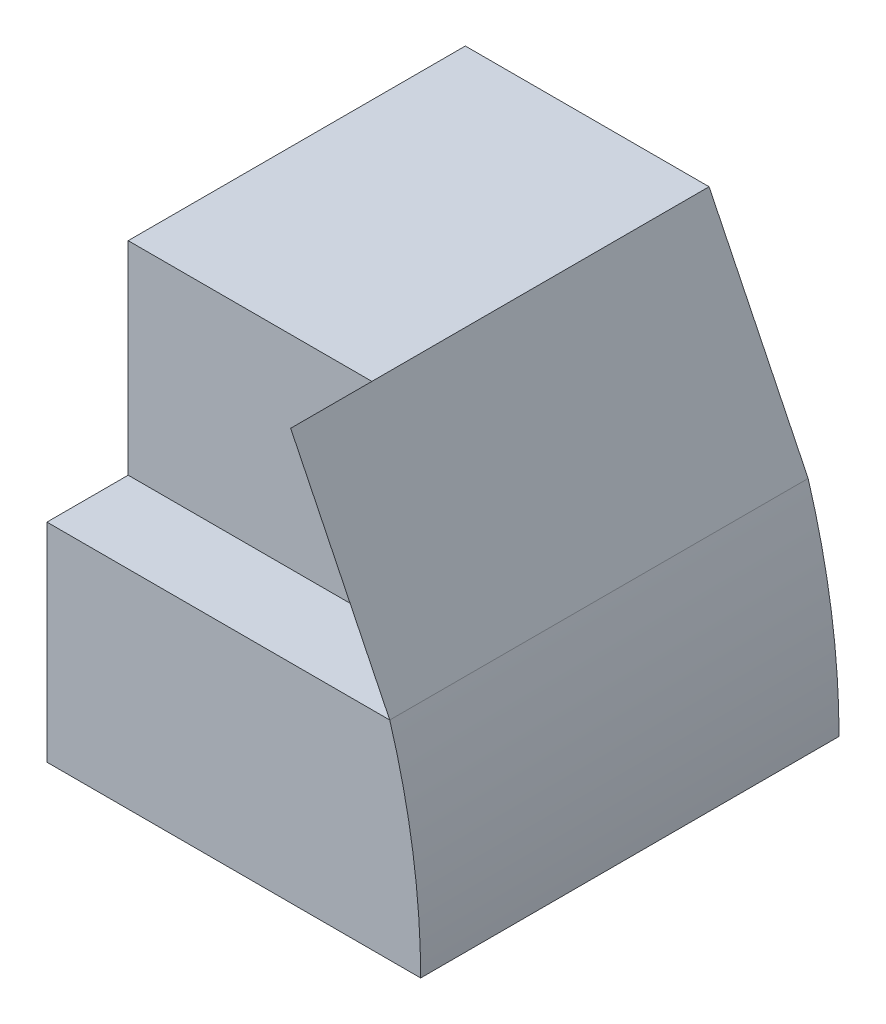
ISO-10303-21;
HEADER;
FILE_DESCRIPTION(('STEP AP214'),'2;1');
FILE_NAME('part.step','',(''),(''),'','','');
FILE_SCHEMA(('AUTOMOTIVE_DESIGN { 1 0 10303 214 1 1 1 1 }'));
ENDSEC;
DATA;
#1=APPLICATION_CONTEXT('core data for automotive mechanical design processes');
#2=APPLICATION_PROTOCOL_DEFINITION('international standard','automotive_design',2000,#1);
#3=PRODUCT_CONTEXT('',#1,'mechanical');
#4=PRODUCT('Part','Part','',(#3));
#5=PRODUCT_RELATED_PRODUCT_CATEGORY('part','',(#4));
#6=PRODUCT_DEFINITION_FORMATION('','',#4);
#7=PRODUCT_DEFINITION_CONTEXT('part definition',#1,'design');
#8=PRODUCT_DEFINITION('design','',#6,#7);
#9=PRODUCT_DEFINITION_SHAPE('','',#8);
#10=(LENGTH_UNIT() NAMED_UNIT(*) SI_UNIT(.MILLI.,.METRE.));
#11=(NAMED_UNIT(*) PLANE_ANGLE_UNIT() SI_UNIT($,.RADIAN.));
#12=(NAMED_UNIT(*) SI_UNIT($,.STERADIAN.) SOLID_ANGLE_UNIT());
#13=UNCERTAINTY_MEASURE_WITH_UNIT(LENGTH_MEASURE(1.E-05),#10,'distance_accuracy_value','');
#14=(GEOMETRIC_REPRESENTATION_CONTEXT(3) GLOBAL_UNCERTAINTY_ASSIGNED_CONTEXT((#13)) GLOBAL_UNIT_ASSIGNED_CONTEXT((#10,
#11,#12)) REPRESENTATION_CONTEXT('',''));
#15=CARTESIAN_POINT('',(0.,0.,0.));
#16=DIRECTION('',(0.,0.,1.));
#17=DIRECTION('',(1.,0.,0.));
#18=AXIS2_PLACEMENT_3D('',#15,#16,#17);
#19=CARTESIAN_POINT('',(7201.125,5060.,5150.));
#20=DIRECTION('',(-0.898776264157635,-0.438407603705552,0.));
#21=DIRECTION('',(0.,0.,-1.));
#22=AXIS2_PLACEMENT_3D('',#19,#20,#21);
#23=PLANE('',#22);
#24=DIRECTION('',(0.,0.,-1.));
#25=VECTOR('',#24,1.);
#26=CARTESIAN_POINT('',(7201.125,5060.,2575.));
#27=LINE('',#26,#25);
#28=CARTESIAN_POINT('',(7201.125,5060.,5150.));
#29=VERTEX_POINT('',#28);
#30=CARTESIAN_POINT('',(7201.125,5060.,0.));
#31=VERTEX_POINT('',#30);
#32=EDGE_CURVE('E13',#29,#31,#27,.T.);
#33=ORIENTED_EDGE('',*,*,#32,.T.);
#34=DIRECTION('',(0.438407603705552,-0.898776264157635,0.));
#35=VECTOR('',#34,1.);
#36=CARTESIAN_POINT('',(7810.85350139245,3810.,0.));
#37=LINE('',#36,#35);
#38=CARTESIAN_POINT('',(8420.5820027849,2560.,0.));
#39=VERTEX_POINT('',#38);
#40=EDGE_CURVE('E66',#31,#39,#37,.T.);
#41=ORIENTED_EDGE('',*,*,#40,.T.);
#42=DIRECTION('',(0.,0.,1.));
#43=VECTOR('',#42,1.);
#44=CARTESIAN_POINT('',(8420.5820027849,2560.,2575.));
#45=LINE('',#44,#43);
#46=CARTESIAN_POINT('',(8420.5820027849,2560.,5150.));
#47=VERTEX_POINT('',#46);
#48=EDGE_CURVE('E74',#39,#47,#45,.T.);
#49=ORIENTED_EDGE('',*,*,#48,.T.);
#50=DIRECTION('',(-0.438407603705552,0.898776264157635,0.));
#51=VECTOR('',#50,1.);
#52=CARTESIAN_POINT('',(7810.85350139245,3810.,5150.));
#53=LINE('',#52,#51);
#54=EDGE_CURVE('E60',#47,#29,#53,.T.);
#55=ORIENTED_EDGE('',*,*,#54,.T.);
#56=EDGE_LOOP('',(#33,#41,#49,#55));
#57=FACE_BOUND('',#56,.T.);
#58=ADVANCED_FACE('F59',(#57),#23,.T.);
#59=OPEN_SHELL('',(#58));
#60=SHELL_BASED_SURFACE_MODEL('B2',(#59));
#61=CARTESIAN_POINT('',(4201.125,-5.63337527607782E-13,5150.));
#62=DIRECTION('',(1.,0.,0.));
#63=DIRECTION('',(0.,0.,-1.));
#64=AXIS2_PLACEMENT_3D('',#61,#62,#63);
#65=PLANE('',#64);
#66=DIRECTION('',(0.,-1.,0.));
#67=VECTOR('',#66,1.);
#68=CARTESIAN_POINT('',(4201.125,-5.63337527607782E-13,5150.));
#69=LINE('',#68,#67);
#70=CARTESIAN_POINT('',(4201.125,2560.,5150.));
#71=VERTEX_POINT('',#70);
#72=CARTESIAN_POINT('',(4201.125,-5.63337527607782E-13,5150.));
#73=VERTEX_POINT('',#72);
#74=EDGE_CURVE('E153',#71,#73,#69,.T.);
#75=ORIENTED_EDGE('',*,*,#74,.F.);
#76=DIRECTION('',(0.,0.,1.));
#77=VECTOR('',#76,1.);
#78=CARTESIAN_POINT('',(4201.125,2560.,5150.));
#79=LINE('',#78,#77);
#80=CARTESIAN_POINT('',(4201.125,2560.,4150.));
#81=VERTEX_POINT('',#80);
#82=EDGE_CURVE('E178',#81,#71,#79,.T.);
#83=ORIENTED_EDGE('',*,*,#82,.F.);
#84=DIRECTION('',(0.,-1.,0.));
#85=VECTOR('',#84,1.);
#86=CARTESIAN_POINT('',(4201.125,5060.,4150.));
#87=LINE('',#86,#85);
#88=CARTESIAN_POINT('',(4201.125,5060.,4150.));
#89=VERTEX_POINT('',#88);
#90=EDGE_CURVE('E171',#89,#81,#87,.T.);
#91=ORIENTED_EDGE('',*,*,#90,.F.);
#92=DIRECTION('',(0.,0.,-1.));
#93=VECTOR('',#92,1.);
#94=CARTESIAN_POINT('',(4201.125,5060.,5150.));
#95=LINE('',#94,#93);
#96=CARTESIAN_POINT('',(4201.125,5060.,0.));
#97=VERTEX_POINT('',#96);
#98=EDGE_CURVE('E150',#89,#97,#95,.T.);
#99=ORIENTED_EDGE('',*,*,#98,.T.);
#100=DIRECTION('',(0.,-1.,0.));
#101=VECTOR('',#100,1.);
#102=CARTESIAN_POINT('',(4201.125,-5.63337527607782E-13,0.));
#103=LINE('',#102,#101);
#104=CARTESIAN_POINT('',(4201.125,-5.63337527607782E-13,0.));
#105=VERTEX_POINT('',#104);
#106=EDGE_CURVE('E213',#97,#105,#103,.T.);
#107=ORIENTED_EDGE('',*,*,#106,.T.);
#108=DIRECTION('',(0.,0.,-1.));
#109=VECTOR('',#108,1.);
#110=CARTESIAN_POINT('',(4201.125,-5.63337527607782E-13,5150.));
#111=LINE('',#110,#109);
#112=EDGE_CURVE('E57',#73,#105,#111,.T.);
#113=ORIENTED_EDGE('',*,*,#112,.F.);
#114=EDGE_LOOP('',(#75,#83,#91,#99,#107,#113));
#115=FACE_BOUND('',#114,.T.);
#116=ADVANCED_FACE('F103',(#115),#65,.F.);
#117=CARTESIAN_POINT('',(8801.125,0.,5150.));
#118=DIRECTION('',(0.,1.,0.));
#119=DIRECTION('',(-1.,0.,0.));
#120=AXIS2_PLACEMENT_3D('',#117,#118,#119);
#121=PLANE('',#120);
#122=DIRECTION('',(1.,0.,0.));
#123=VECTOR('',#122,1.);
#124=CARTESIAN_POINT('',(8801.125,0.,0.));
#125=LINE('',#124,#123);
#126=CARTESIAN_POINT('',(8801.125,1.07782695601457E-12,0.));
#127=VERTEX_POINT('',#126);
#128=EDGE_CURVE('E206',#105,#127,#125,.T.);
#129=ORIENTED_EDGE('',*,*,#128,.T.);
#130=DIRECTION('',(0.,0.,-1.));
#131=VECTOR('',#130,1.);
#132=CARTESIAN_POINT('',(8801.125,1.07782695601457E-12,5150.));
#133=LINE('',#132,#131);
#134=CARTESIAN_POINT('',(8801.125,1.07782695601457E-12,5150.));
#135=VERTEX_POINT('',#134);
#136=EDGE_CURVE('E110',#135,#127,#133,.T.);
#137=ORIENTED_EDGE('',*,*,#136,.F.);
#138=DIRECTION('',(1.,0.,0.));
#139=VECTOR('',#138,1.);
#140=CARTESIAN_POINT('',(8801.125,0.,5150.));
#141=LINE('',#140,#139);
#142=EDGE_CURVE('E218',#73,#135,#141,.T.);
#143=ORIENTED_EDGE('',*,*,#142,.F.);
#144=ORIENTED_EDGE('',*,*,#112,.T.);
#145=EDGE_LOOP('',(#129,#137,#143,#144));
#146=FACE_BOUND('',#145,.T.);
#147=ADVANCED_FACE('F229',(#146),#121,.F.);
#148=CARTESIAN_POINT('',(0.,0.,5150.));
#149=DIRECTION('',(0.,0.,-1.));
#150=DIRECTION('',(-1.,0.,0.));
#151=AXIS2_PLACEMENT_3D('',#148,#149,#150);
#152=CYLINDRICAL_SURFACE('',#151,8801.125);
#153=CARTESIAN_POINT('',(0.,0.,0.));
#154=DIRECTION('',(0.,0.,1.));
#155=DIRECTION('',(-1.,0.,0.));
#156=AXIS2_PLACEMENT_3D('',#153,#154,#155);
#157=CIRCLE('',#156,8801.125);
#158=CARTESIAN_POINT('',(8420.5820027849,2560.,0.));
#159=VERTEX_POINT('',#158);
#160=EDGE_CURVE('E201',#127,#159,#157,.T.);
#161=ORIENTED_EDGE('',*,*,#160,.T.);
#162=DIRECTION('',(0.,0.,-1.));
#163=VECTOR('',#162,1.);
#164=CARTESIAN_POINT('',(8420.5820027849,2560.,5150.));
#165=LINE('',#164,#163);
#166=CARTESIAN_POINT('',(8420.5820027849,2560.,5150.));
#167=VERTEX_POINT('',#166);
#168=EDGE_CURVE('E194',#167,#159,#165,.T.);
#169=ORIENTED_EDGE('',*,*,#168,.F.);
#170=CARTESIAN_POINT('',(0.,0.,5150.));
#171=DIRECTION('',(0.,0.,1.));
#172=DIRECTION('',(-1.,0.,0.));
#173=AXIS2_PLACEMENT_3D('',#170,#171,#172);
#174=CIRCLE('',#173,8801.125);
#175=EDGE_CURVE('E123',#135,#167,#174,.T.);
#176=ORIENTED_EDGE('',*,*,#175,.F.);
#177=ORIENTED_EDGE('',*,*,#136,.T.);
#178=EDGE_LOOP('',(#161,#169,#176,#177));
#179=FACE_BOUND('',#178,.T.);
#180=ADVANCED_FACE('F200',(#179),#152,.T.);
#181=CARTESIAN_POINT('',(7201.125,2560.,5150.));
#182=DIRECTION('',(0.,-1.,0.));
#183=DIRECTION('',(0.,0.,-1.));
#184=AXIS2_PLACEMENT_3D('',#181,#182,#183);
#185=PLANE('',#184);
#186=DIRECTION('',(0.,0.,-1.));
#187=VECTOR('',#186,1.);
#188=CARTESIAN_POINT('',(7201.125,2560.,5150.));
#189=LINE('',#188,#187);
#190=CARTESIAN_POINT('',(7201.125,2560.,4150.));
#191=VERTEX_POINT('',#190);
#192=CARTESIAN_POINT('',(7201.125,2560.,0.));
#193=VERTEX_POINT('',#192);
#194=EDGE_CURVE('E187',#191,#193,#189,.T.);
#195=ORIENTED_EDGE('',*,*,#194,.F.);
#196=DIRECTION('',(-1.,0.,0.));
#197=VECTOR('',#196,1.);
#198=CARTESIAN_POINT('',(8801.125,2560.,4150.));
#199=LINE('',#198,#197);
#200=EDGE_CURVE('E177',#191,#81,#199,.T.);
#201=ORIENTED_EDGE('',*,*,#200,.T.);
#202=ORIENTED_EDGE('',*,*,#82,.T.);
#203=DIRECTION('',(-1.,0.,0.));
#204=VECTOR('',#203,1.);
#205=CARTESIAN_POINT('',(7201.125,2560.,5150.));
#206=LINE('',#205,#204);
#207=EDGE_CURVE('E117',#167,#71,#206,.T.);
#208=ORIENTED_EDGE('',*,*,#207,.F.);
#209=ORIENTED_EDGE('',*,*,#168,.T.);
#210=DIRECTION('',(-1.,0.,0.));
#211=VECTOR('',#210,1.);
#212=CARTESIAN_POINT('',(7201.125,2560.,0.));
#213=LINE('',#212,#211);
#214=EDGE_CURVE('E209',#159,#193,#213,.T.);
#215=ORIENTED_EDGE('',*,*,#214,.T.);
#216=EDGE_LOOP('',(#195,#201,#202,#208,#209,#215));
#217=FACE_BOUND('',#216,.T.);
#218=ADVANCED_FACE('F228',(#217),#185,.F.);
#219=CARTESIAN_POINT('',(7201.125,5060.,5150.));
#220=DIRECTION('',(-1.,0.,0.));
#221=DIRECTION('',(0.,0.,1.));
#222=AXIS2_PLACEMENT_3D('',#219,#220,#221);
#223=PLANE('',#222);
#224=DIRECTION('',(0.,0.,-1.));
#225=VECTOR('',#224,1.);
#226=CARTESIAN_POINT('',(7201.125,5060.,5150.));
#227=LINE('',#226,#225);
#228=CARTESIAN_POINT('',(7201.125,5060.,4150.));
#229=VERTEX_POINT('',#228);
#230=CARTESIAN_POINT('',(7201.125,5060.,0.));
#231=VERTEX_POINT('',#230);
#232=EDGE_CURVE('E185',#229,#231,#227,.T.);
#233=ORIENTED_EDGE('',*,*,#232,.F.);
#234=DIRECTION('',(0.,-1.,0.));
#235=VECTOR('',#234,1.);
#236=CARTESIAN_POINT('',(7201.125,5060.,4150.));
#237=LINE('',#236,#235);
#238=EDGE_CURVE('E174',#229,#191,#237,.T.);
#239=ORIENTED_EDGE('',*,*,#238,.T.);
#240=ORIENTED_EDGE('',*,*,#194,.T.);
#241=DIRECTION('',(0.,1.,0.));
#242=VECTOR('',#241,1.);
#243=CARTESIAN_POINT('',(7201.125,5060.,0.));
#244=LINE('',#243,#242);
#245=EDGE_CURVE('E211',#193,#231,#244,.T.);
#246=ORIENTED_EDGE('',*,*,#245,.T.);
#247=EDGE_LOOP('',(#233,#239,#240,#246));
#248=FACE_BOUND('',#247,.T.);
#249=ADVANCED_FACE('F238',(#248),#223,.F.);
#250=CARTESIAN_POINT('',(4201.125,5060.,5150.));
#251=DIRECTION('',(0.,-1.,0.));
#252=DIRECTION('',(0.,0.,-1.));
#253=AXIS2_PLACEMENT_3D('',#250,#251,#252);
#254=PLANE('',#253);
#255=ORIENTED_EDGE('',*,*,#98,.F.);
#256=DIRECTION('',(-1.,0.,0.));
#257=VECTOR('',#256,1.);
#258=CARTESIAN_POINT('',(8801.125,5060.,4150.));
#259=LINE('',#258,#257);
#260=EDGE_CURVE('E169',#229,#89,#259,.T.);
#261=ORIENTED_EDGE('',*,*,#260,.F.);
#262=ORIENTED_EDGE('',*,*,#232,.T.);
#263=DIRECTION('',(-1.,0.,0.));
#264=VECTOR('',#263,1.);
#265=CARTESIAN_POINT('',(4201.125,5060.,0.));
#266=LINE('',#265,#264);
#267=EDGE_CURVE('E183',#231,#97,#266,.T.);
#268=ORIENTED_EDGE('',*,*,#267,.T.);
#269=EDGE_LOOP('',(#255,#261,#262,#268));
#270=FACE_BOUND('',#269,.T.);
#271=ADVANCED_FACE('F181',(#270),#254,.F.);
#272=CARTESIAN_POINT('',(0.,0.,5150.));
#273=DIRECTION('',(0.,0.,-1.));
#274=DIRECTION('',(-1.,0.,0.));
#275=AXIS2_PLACEMENT_3D('',#272,#273,#274);
#276=PLANE('',#275);
#277=ORIENTED_EDGE('',*,*,#207,.T.);
#278=ORIENTED_EDGE('',*,*,#74,.T.);
#279=ORIENTED_EDGE('',*,*,#142,.T.);
#280=ORIENTED_EDGE('',*,*,#175,.T.);
#281=EDGE_LOOP('',(#277,#278,#279,#280));
#282=FACE_BOUND('',#281,.T.);
#283=ADVANCED_FACE('F230',(#282),#276,.F.);
#284=CARTESIAN_POINT('',(0.,0.,0.));
#285=DIRECTION('',(0.,0.,-1.));
#286=DIRECTION('',(-1.,0.,0.));
#287=AXIS2_PLACEMENT_3D('',#284,#285,#286);
#288=PLANE('',#287);
#289=ORIENTED_EDGE('',*,*,#106,.F.);
#290=ORIENTED_EDGE('',*,*,#267,.F.);
#291=ORIENTED_EDGE('',*,*,#245,.F.);
#292=ORIENTED_EDGE('',*,*,#214,.F.);
#293=ORIENTED_EDGE('',*,*,#160,.F.);
#294=ORIENTED_EDGE('',*,*,#128,.F.);
#295=EDGE_LOOP('',(#289,#290,#291,#292,#293,#294));
#296=FACE_BOUND('',#295,.T.);
#297=ADVANCED_FACE('F205',(#296),#288,.T.);
#298=CARTESIAN_POINT('',(8801.125,5060.,4150.));
#299=DIRECTION('',(0.,0.,-1.));
#300=DIRECTION('',(-1.,0.,0.));
#301=AXIS2_PLACEMENT_3D('',#298,#299,#300);
#302=PLANE('',#301);
#303=ORIENTED_EDGE('',*,*,#260,.T.);
#304=ORIENTED_EDGE('',*,*,#90,.T.);
#305=ORIENTED_EDGE('',*,*,#200,.F.);
#306=ORIENTED_EDGE('',*,*,#238,.F.);
#307=EDGE_LOOP('',(#303,#304,#305,#306));
#308=FACE_BOUND('',#307,.T.);
#309=ADVANCED_FACE('F170',(#308),#302,.F.);
#310=CLOSED_SHELL('',(#116,#147,#180,#218,#249,#271,#283,#297,#309));
#311=MANIFOLD_SOLID_BREP('B7',#310);
#312=ADVANCED_BREP_SHAPE_REPRESENTATION('',(#18,#311),#14);
#313=MANIFOLD_SURFACE_SHAPE_REPRESENTATION('',(#18,#60),#14);
#314=SHAPE_REPRESENTATION('',(#18),#14);
#315=SHAPE_DEFINITION_REPRESENTATION(#9,#314);
#316=SHAPE_REPRESENTATION_RELATIONSHIP('','',#314,#312);
#317=SHAPE_REPRESENTATION_RELATIONSHIP('','',#314,#313);
ENDSEC;
END-ISO-10303-21;
